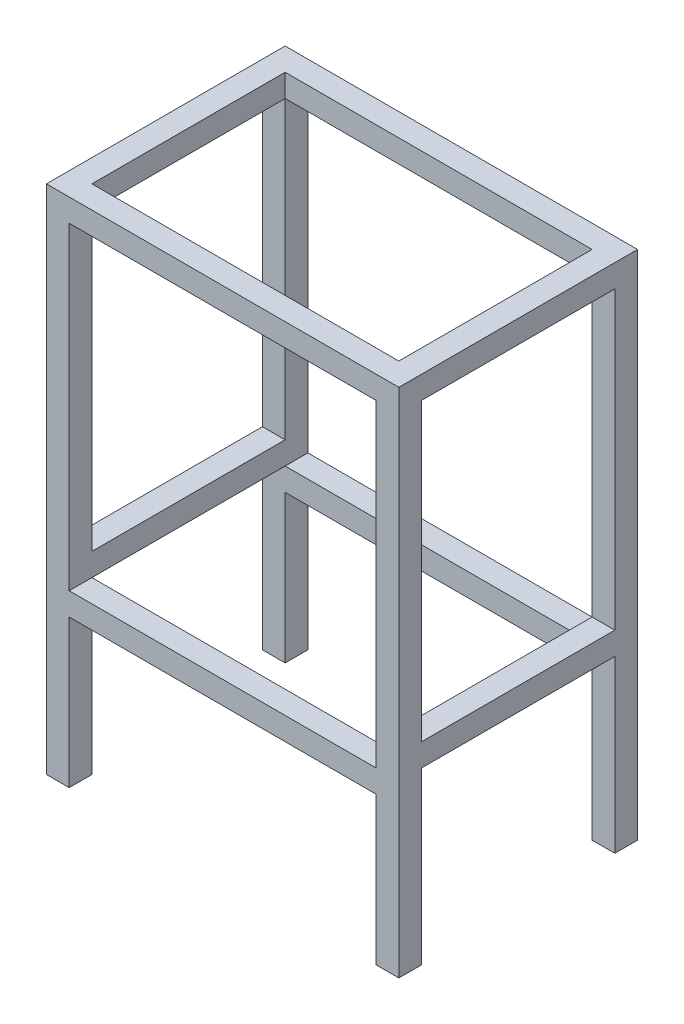
ISO-10303-21;
HEADER;
FILE_DESCRIPTION(('STEP AP214'),'2;1');
FILE_NAME('part.step','',(''),(''),'','','');
FILE_SCHEMA(('AUTOMOTIVE_DESIGN { 1 0 10303 214 1 1 1 1 }'));
ENDSEC;
DATA;
#1=APPLICATION_CONTEXT('core data for automotive mechanical design processes');
#2=APPLICATION_PROTOCOL_DEFINITION('international standard','automotive_design',2000,#1);
#3=PRODUCT_CONTEXT('',#1,'mechanical');
#4=PRODUCT('Part','Part','',(#3));
#5=PRODUCT_RELATED_PRODUCT_CATEGORY('part','',(#4));
#6=PRODUCT_DEFINITION_FORMATION('','',#4);
#7=PRODUCT_DEFINITION_CONTEXT('part definition',#1,'design');
#8=PRODUCT_DEFINITION('design','',#6,#7);
#9=PRODUCT_DEFINITION_SHAPE('','',#8);
#10=(LENGTH_UNIT() NAMED_UNIT(*) SI_UNIT(.MILLI.,.METRE.));
#11=(NAMED_UNIT(*) PLANE_ANGLE_UNIT() SI_UNIT($,.RADIAN.));
#12=(NAMED_UNIT(*) SI_UNIT($,.STERADIAN.) SOLID_ANGLE_UNIT());
#13=UNCERTAINTY_MEASURE_WITH_UNIT(LENGTH_MEASURE(1.E-05),#10,'distance_accuracy_value','');
#14=(GEOMETRIC_REPRESENTATION_CONTEXT(3) GLOBAL_UNCERTAINTY_ASSIGNED_CONTEXT((#13)) GLOBAL_UNIT_ASSIGNED_CONTEXT((#10,
#11,#12)) REPRESENTATION_CONTEXT('',''));
#15=CARTESIAN_POINT('',(0.,0.,0.));
#16=DIRECTION('',(0.,0.,1.));
#17=DIRECTION('',(1.,0.,0.));
#18=AXIS2_PLACEMENT_3D('',#15,#16,#17);
#19=CARTESIAN_POINT('',(-135.,450.,-85.));
#20=DIRECTION('',(0.,0.,-1.));
#21=DIRECTION('',(-1.,0.,0.));
#22=AXIS2_PLACEMENT_3D('',#19,#20,#21);
#23=PLANE('',#22);
#24=DIRECTION('',(1.,0.,0.));
#25=VECTOR('',#24,1.);
#26=CARTESIAN_POINT('',(-155.,150.,-85.0000000000001));
#27=LINE('',#26,#25);
#28=CARTESIAN_POINT('',(135.,150.,-85.));
#29=VERTEX_POINT('',#28);
#30=CARTESIAN_POINT('',(155.,150.,-85.));
#31=VERTEX_POINT('',#30);
#32=EDGE_CURVE('E423',#29,#31,#27,.T.);
#33=ORIENTED_EDGE('',*,*,#32,.F.);
#34=DIRECTION('',(-1.,0.,0.));
#35=VECTOR('',#34,1.);
#36=CARTESIAN_POINT('',(-135.,150.,-85.));
#37=LINE('',#36,#35);
#38=CARTESIAN_POINT('',(-135.,150.,-85.0000000000001));
#39=VERTEX_POINT('',#38);
#40=EDGE_CURVE('E286',#29,#39,#37,.T.);
#41=ORIENTED_EDGE('',*,*,#40,.T.);
#42=CARTESIAN_POINT('',(-155.,150.,-85.0000000000001));
#43=VERTEX_POINT('',#42);
#44=EDGE_CURVE('E440',#43,#39,#27,.T.);
#45=ORIENTED_EDGE('',*,*,#44,.F.);
#46=DIRECTION('',(0.,1.,0.));
#47=VECTOR('',#46,1.);
#48=CARTESIAN_POINT('',(-155.,0.,-85.));
#49=LINE('',#48,#47);
#50=CARTESIAN_POINT('',(-155.,0.,-85.));
#51=VERTEX_POINT('',#50);
#52=EDGE_CURVE('E410',#51,#43,#49,.T.);
#53=ORIENTED_EDGE('',*,*,#52,.F.);
#54=DIRECTION('',(1.,0.,0.));
#55=VECTOR('',#54,1.);
#56=CARTESIAN_POINT('',(-135.,0.,-85.));
#57=LINE('',#56,#55);
#58=CARTESIAN_POINT('',(-135.,0.,-85.));
#59=VERTEX_POINT('',#58);
#60=EDGE_CURVE('E525',#51,#59,#57,.T.);
#61=ORIENTED_EDGE('',*,*,#60,.T.);
#62=DIRECTION('',(0.,1.,0.));
#63=VECTOR('',#62,1.);
#64=CARTESIAN_POINT('',(-135.,450.,-85.));
#65=LINE('',#64,#63);
#66=CARTESIAN_POINT('',(-135.,130.,-85.));
#67=VERTEX_POINT('',#66);
#68=EDGE_CURVE('E405',#59,#67,#65,.T.);
#69=ORIENTED_EDGE('',*,*,#68,.T.);
#70=DIRECTION('',(1.,0.,0.));
#71=VECTOR('',#70,1.);
#72=CARTESIAN_POINT('',(-135.,130.,-85.));
#73=LINE('',#72,#71);
#74=CARTESIAN_POINT('',(135.,130.,-85.));
#75=VERTEX_POINT('',#74);
#76=EDGE_CURVE('E401',#67,#75,#73,.T.);
#77=ORIENTED_EDGE('',*,*,#76,.T.);
#78=DIRECTION('',(0.,-1.,0.));
#79=VECTOR('',#78,1.);
#80=CARTESIAN_POINT('',(135.,450.,-85.));
#81=LINE('',#80,#79);
#82=CARTESIAN_POINT('',(135.,0.,-85.));
#83=VERTEX_POINT('',#82);
#84=EDGE_CURVE('E383',#75,#83,#81,.T.);
#85=ORIENTED_EDGE('',*,*,#84,.T.);
#86=CARTESIAN_POINT('',(155.,0.,-85.));
#87=VERTEX_POINT('',#86);
#88=EDGE_CURVE('E507',#83,#87,#57,.T.);
#89=ORIENTED_EDGE('',*,*,#88,.T.);
#90=DIRECTION('',(0.,1.,0.));
#91=VECTOR('',#90,1.);
#92=CARTESIAN_POINT('',(155.,0.,-85.));
#93=LINE('',#92,#91);
#94=EDGE_CURVE('E409',#87,#31,#93,.T.);
#95=ORIENTED_EDGE('',*,*,#94,.T.);
#96=EDGE_LOOP('',(#33,#41,#45,#53,#61,#69,#77,#85,#89,#95));
#97=FACE_BOUND('',#96,.T.);
#98=ADVANCED_FACE('F69',(#97),#23,.F.);
#99=DIRECTION('',(1.,0.,0.));
#100=VECTOR('',#99,1.);
#101=CARTESIAN_POINT('',(-155.,170.,-85.0000000000001));
#102=LINE('',#101,#100);
#103=CARTESIAN_POINT('',(-155.,170.,-85.0000000000001));
#104=VERTEX_POINT('',#103);
#105=CARTESIAN_POINT('',(-135.,170.,-85.0000000000001));
#106=VERTEX_POINT('',#105);
#107=EDGE_CURVE('E485',#104,#106,#102,.T.);
#108=ORIENTED_EDGE('',*,*,#107,.T.);
#109=DIRECTION('',(0.,1.,0.));
#110=VECTOR('',#109,1.);
#111=CARTESIAN_POINT('',(-135.,450.,-85.));
#112=LINE('',#111,#110);
#113=CARTESIAN_POINT('',(-135.,430.,-85.0000000000001));
#114=VERTEX_POINT('',#113);
#115=EDGE_CURVE('E333',#106,#114,#112,.T.);
#116=ORIENTED_EDGE('',*,*,#115,.T.);
#117=DIRECTION('',(1.,0.,0.));
#118=VECTOR('',#117,1.);
#119=CARTESIAN_POINT('',(-155.,430.,-85.0000000000001));
#120=LINE('',#119,#118);
#121=CARTESIAN_POINT('',(-155.,430.,-85.0000000000001));
#122=VERTEX_POINT('',#121);
#123=EDGE_CURVE('E490',#122,#114,#120,.T.);
#124=ORIENTED_EDGE('',*,*,#123,.F.);
#125=DIRECTION('',(0.,-1.,0.));
#126=VECTOR('',#125,1.);
#127=CARTESIAN_POINT('',(-155.,430.,-85.0000000000001));
#128=LINE('',#127,#126);
#129=EDGE_CURVE('E458',#122,#104,#128,.T.);
#130=ORIENTED_EDGE('',*,*,#129,.T.);
#131=EDGE_LOOP('',(#108,#116,#124,#130));
#132=FACE_BOUND('',#131,.T.);
#133=ADVANCED_FACE('F657',(#132),#23,.F.);
#134=DIRECTION('',(0.,-1.,0.));
#135=VECTOR('',#134,1.);
#136=CARTESIAN_POINT('',(-135.,450.,-85.));
#137=LINE('',#136,#135);
#138=CARTESIAN_POINT('',(-135.,450.,-85.));
#139=VERTEX_POINT('',#138);
#140=EDGE_CURVE('E533',#139,#114,#137,.T.);
#141=ORIENTED_EDGE('',*,*,#140,.T.);
#142=DIRECTION('',(1.,0.,0.));
#143=VECTOR('',#142,1.);
#144=CARTESIAN_POINT('',(-135.,430.,-85.));
#145=LINE('',#144,#143);
#146=CARTESIAN_POINT('',(135.,430.,-85.));
#147=VERTEX_POINT('',#146);
#148=EDGE_CURVE('E341',#114,#147,#145,.T.);
#149=ORIENTED_EDGE('',*,*,#148,.T.);
#150=DIRECTION('',(0.,-1.,0.));
#151=VECTOR('',#150,1.);
#152=CARTESIAN_POINT('',(135.,450.,-85.));
#153=LINE('',#152,#151);
#154=CARTESIAN_POINT('',(135.,450.,-85.));
#155=VERTEX_POINT('',#154);
#156=EDGE_CURVE('E524',#155,#147,#153,.T.);
#157=ORIENTED_EDGE('',*,*,#156,.F.);
#158=DIRECTION('',(1.,0.,0.));
#159=VECTOR('',#158,1.);
#160=CARTESIAN_POINT('',(-135.,450.,-85.));
#161=LINE('',#160,#159);
#162=EDGE_CURVE('E508',#139,#155,#161,.T.);
#163=ORIENTED_EDGE('',*,*,#162,.F.);
#164=EDGE_LOOP('',(#141,#149,#157,#163));
#165=FACE_BOUND('',#164,.T.);
#166=ADVANCED_FACE('F649',(#165),#23,.F.);
#167=CARTESIAN_POINT('',(-135.,450.,85.));
#168=DIRECTION('',(0.,0.,-1.));
#169=DIRECTION('',(-1.,0.,0.));
#170=AXIS2_PLACEMENT_3D('',#167,#168,#169);
#171=PLANE('',#170);
#172=DIRECTION('',(-1.,0.,0.));
#173=VECTOR('',#172,1.);
#174=CARTESIAN_POINT('',(-135.,150.,85.));
#175=LINE('',#174,#173);
#176=CARTESIAN_POINT('',(135.,150.,85.));
#177=VERTEX_POINT('',#176);
#178=CARTESIAN_POINT('',(-135.,150.,85.));
#179=VERTEX_POINT('',#178);
#180=EDGE_CURVE('E12',#177,#179,#175,.T.);
#181=ORIENTED_EDGE('',*,*,#180,.F.);
#182=DIRECTION('',(1.,0.,0.));
#183=VECTOR('',#182,1.);
#184=CARTESIAN_POINT('',(-155.,150.,85.));
#185=LINE('',#184,#183);
#186=CARTESIAN_POINT('',(155.,150.,85.));
#187=VERTEX_POINT('',#186);
#188=EDGE_CURVE('E439',#177,#187,#185,.T.);
#189=ORIENTED_EDGE('',*,*,#188,.T.);
#190=DIRECTION('',(0.,-1.,0.));
#191=VECTOR('',#190,1.);
#192=CARTESIAN_POINT('',(155.,150.,85.));
#193=LINE('',#192,#191);
#194=CARTESIAN_POINT('',(155.,0.,85.));
#195=VERTEX_POINT('',#194);
#196=EDGE_CURVE('E415',#187,#195,#193,.T.);
#197=ORIENTED_EDGE('',*,*,#196,.T.);
#198=DIRECTION('',(1.,0.,0.));
#199=VECTOR('',#198,1.);
#200=CARTESIAN_POINT('',(-135.,0.,85.));
#201=LINE('',#200,#199);
#202=CARTESIAN_POINT('',(135.,0.,85.));
#203=VERTEX_POINT('',#202);
#204=EDGE_CURVE('E529',#203,#195,#201,.T.);
#205=ORIENTED_EDGE('',*,*,#204,.F.);
#206=DIRECTION('',(0.,-1.,0.));
#207=VECTOR('',#206,1.);
#208=CARTESIAN_POINT('',(135.,450.,85.));
#209=LINE('',#208,#207);
#210=CARTESIAN_POINT('',(135.,130.,85.));
#211=VERTEX_POINT('',#210);
#212=EDGE_CURVE('E605',#211,#203,#209,.T.);
#213=ORIENTED_EDGE('',*,*,#212,.F.);
#214=DIRECTION('',(1.,0.,0.));
#215=VECTOR('',#214,1.);
#216=CARTESIAN_POINT('',(-135.,130.,85.));
#217=LINE('',#216,#215);
#218=CARTESIAN_POINT('',(-135.,130.,85.));
#219=VERTEX_POINT('',#218);
#220=EDGE_CURVE('E608',#219,#211,#217,.T.);
#221=ORIENTED_EDGE('',*,*,#220,.F.);
#222=DIRECTION('',(0.,1.,0.));
#223=VECTOR('',#222,1.);
#224=CARTESIAN_POINT('',(-135.,450.,85.));
#225=LINE('',#224,#223);
#226=CARTESIAN_POINT('',(-135.,0.,85.));
#227=VERTEX_POINT('',#226);
#228=EDGE_CURVE('E612',#227,#219,#225,.T.);
#229=ORIENTED_EDGE('',*,*,#228,.F.);
#230=CARTESIAN_POINT('',(-155.,0.,85.));
#231=VERTEX_POINT('',#230);
#232=EDGE_CURVE('E513',#231,#227,#201,.T.);
#233=ORIENTED_EDGE('',*,*,#232,.F.);
#234=DIRECTION('',(0.,-1.,0.));
#235=VECTOR('',#234,1.);
#236=CARTESIAN_POINT('',(-155.,150.,85.));
#237=LINE('',#236,#235);
#238=CARTESIAN_POINT('',(-155.,150.,85.));
#239=VERTEX_POINT('',#238);
#240=EDGE_CURVE('E419',#239,#231,#237,.T.);
#241=ORIENTED_EDGE('',*,*,#240,.F.);
#242=EDGE_CURVE('E434',#239,#179,#185,.T.);
#243=ORIENTED_EDGE('',*,*,#242,.T.);
#244=EDGE_LOOP('',(#181,#189,#197,#205,#213,#221,#229,#233,#241,#243));
#245=FACE_BOUND('',#244,.T.);
#246=ADVANCED_FACE('F696',(#245),#171,.T.);
#247=DIRECTION('',(0.,1.,0.));
#248=VECTOR('',#247,1.);
#249=CARTESIAN_POINT('',(-135.,450.,85.));
#250=LINE('',#249,#248);
#251=CARTESIAN_POINT('',(-135.,170.,85.));
#252=VERTEX_POINT('',#251);
#253=CARTESIAN_POINT('',(-135.,430.,85.));
#254=VERTEX_POINT('',#253);
#255=EDGE_CURVE('E330',#252,#254,#250,.T.);
#256=ORIENTED_EDGE('',*,*,#255,.F.);
#257=DIRECTION('',(1.,0.,0.));
#258=VECTOR('',#257,1.);
#259=CARTESIAN_POINT('',(-155.,170.,85.));
#260=LINE('',#259,#258);
#261=CARTESIAN_POINT('',(-155.,170.,85.));
#262=VERTEX_POINT('',#261);
#263=EDGE_CURVE('E480',#262,#252,#260,.T.);
#264=ORIENTED_EDGE('',*,*,#263,.F.);
#265=DIRECTION('',(0.,1.,0.));
#266=VECTOR('',#265,1.);
#267=CARTESIAN_POINT('',(-155.,170.,85.));
#268=LINE('',#267,#266);
#269=CARTESIAN_POINT('',(-155.,430.,84.9999999999999));
#270=VERTEX_POINT('',#269);
#271=EDGE_CURVE('E451',#262,#270,#268,.T.);
#272=ORIENTED_EDGE('',*,*,#271,.T.);
#273=DIRECTION('',(1.,0.,0.));
#274=VECTOR('',#273,1.);
#275=CARTESIAN_POINT('',(-155.,430.,84.9999999999999));
#276=LINE('',#275,#274);
#277=EDGE_CURVE('E495',#270,#254,#276,.T.);
#278=ORIENTED_EDGE('',*,*,#277,.T.);
#279=EDGE_LOOP('',(#256,#264,#272,#278));
#280=FACE_BOUND('',#279,.T.);
#281=ADVANCED_FACE('F706',(#280),#171,.T.);
#282=DIRECTION('',(1.,0.,0.));
#283=VECTOR('',#282,1.);
#284=CARTESIAN_POINT('',(-135.,430.,85.));
#285=LINE('',#284,#283);
#286=CARTESIAN_POINT('',(135.,430.,85.));
#287=VERTEX_POINT('',#286);
#288=EDGE_CURVE('E78',#254,#287,#285,.T.);
#289=ORIENTED_EDGE('',*,*,#288,.F.);
#290=DIRECTION('',(0.,-1.,0.));
#291=VECTOR('',#290,1.);
#292=CARTESIAN_POINT('',(-135.,450.,85.));
#293=LINE('',#292,#291);
#294=CARTESIAN_POINT('',(-135.,450.,85.));
#295=VERTEX_POINT('',#294);
#296=EDGE_CURVE('E538',#295,#254,#293,.T.);
#297=ORIENTED_EDGE('',*,*,#296,.F.);
#298=DIRECTION('',(1.,0.,0.));
#299=VECTOR('',#298,1.);
#300=CARTESIAN_POINT('',(-135.,450.,85.));
#301=LINE('',#300,#299);
#302=CARTESIAN_POINT('',(135.,450.,85.));
#303=VERTEX_POINT('',#302);
#304=EDGE_CURVE('E517',#295,#303,#301,.T.);
#305=ORIENTED_EDGE('',*,*,#304,.T.);
#306=DIRECTION('',(0.,-1.,0.));
#307=VECTOR('',#306,1.);
#308=CARTESIAN_POINT('',(135.,450.,85.));
#309=LINE('',#308,#307);
#310=EDGE_CURVE('E542',#303,#287,#309,.T.);
#311=ORIENTED_EDGE('',*,*,#310,.T.);
#312=EDGE_LOOP('',(#289,#297,#305,#311));
#313=FACE_BOUND('',#312,.T.);
#314=ADVANCED_FACE('F641',(#313),#171,.T.);
#315=CARTESIAN_POINT('',(0.,0.,0.));
#316=DIRECTION('',(0.,-1.,0.));
#317=DIRECTION('',(0.,0.,-1.));
#318=AXIS2_PLACEMENT_3D('',#315,#316,#317);
#319=PLANE('',#318);
#320=DIRECTION('',(0.,0.,1.));
#321=VECTOR('',#320,1.);
#322=CARTESIAN_POINT('',(-135.,0.,-105.));
#323=LINE('',#322,#321);
#324=CARTESIAN_POINT('',(-135.,0.,-105.));
#325=VERTEX_POINT('',#324);
#326=EDGE_CURVE('E379',#325,#59,#323,.T.);
#327=ORIENTED_EDGE('',*,*,#326,.T.);
#328=ORIENTED_EDGE('',*,*,#60,.F.);
#329=DIRECTION('',(0.,0.,1.));
#330=VECTOR('',#329,1.);
#331=CARTESIAN_POINT('',(-155.,0.,-105.));
#332=LINE('',#331,#330);
#333=CARTESIAN_POINT('',(-155.,0.,-105.));
#334=VERTEX_POINT('',#333);
#335=EDGE_CURVE('E554',#334,#51,#332,.T.);
#336=ORIENTED_EDGE('',*,*,#335,.F.);
#337=DIRECTION('',(1.,0.,0.));
#338=VECTOR('',#337,1.);
#339=CARTESIAN_POINT('',(-155.,0.,-105.));
#340=LINE('',#339,#338);
#341=EDGE_CURVE('E565',#334,#325,#340,.T.);
#342=ORIENTED_EDGE('',*,*,#341,.T.);
#343=EDGE_LOOP('',(#327,#328,#336,#342));
#344=FACE_BOUND('',#343,.T.);
#345=ADVANCED_FACE('F700',(#344),#319,.T.);
#346=CARTESIAN_POINT('',(-135.,0.,105.));
#347=VERTEX_POINT('',#346);
#348=EDGE_CURVE('E384',#227,#347,#323,.T.);
#349=ORIENTED_EDGE('',*,*,#348,.T.);
#350=DIRECTION('',(1.,0.,0.));
#351=VECTOR('',#350,1.);
#352=CARTESIAN_POINT('',(-155.,0.,105.));
#353=LINE('',#352,#351);
#354=CARTESIAN_POINT('',(-155.,0.,105.));
#355=VERTEX_POINT('',#354);
#356=EDGE_CURVE('E575',#355,#347,#353,.T.);
#357=ORIENTED_EDGE('',*,*,#356,.F.);
#358=EDGE_CURVE('E579',#231,#355,#332,.T.);
#359=ORIENTED_EDGE('',*,*,#358,.F.);
#360=ORIENTED_EDGE('',*,*,#232,.T.);
#361=EDGE_LOOP('',(#349,#357,#359,#360));
#362=FACE_BOUND('',#361,.T.);
#363=ADVANCED_FACE('F735',(#362),#319,.T.);
#364=DIRECTION('',(0.,0.,1.));
#365=VECTOR('',#364,1.);
#366=CARTESIAN_POINT('',(135.,0.,-105.));
#367=LINE('',#366,#365);
#368=CARTESIAN_POINT('',(135.,0.,-105.));
#369=VERTEX_POINT('',#368);
#370=EDGE_CURVE('E395',#369,#83,#367,.T.);
#371=ORIENTED_EDGE('',*,*,#370,.F.);
#372=CARTESIAN_POINT('',(155.,0.,-105.));
#373=VERTEX_POINT('',#372);
#374=EDGE_CURVE('E537',#369,#373,#340,.T.);
#375=ORIENTED_EDGE('',*,*,#374,.T.);
#376=DIRECTION('',(0.,0.,1.));
#377=VECTOR('',#376,1.);
#378=CARTESIAN_POINT('',(155.,0.,-105.));
#379=LINE('',#378,#377);
#380=EDGE_CURVE('E570',#373,#87,#379,.T.);
#381=ORIENTED_EDGE('',*,*,#380,.T.);
#382=ORIENTED_EDGE('',*,*,#88,.F.);
#383=EDGE_LOOP('',(#371,#375,#381,#382));
#384=FACE_BOUND('',#383,.T.);
#385=ADVANCED_FACE('F701',(#384),#319,.T.);
#386=CARTESIAN_POINT('',(-155.,450.,-105.));
#387=DIRECTION('',(1.,0.,0.));
#388=DIRECTION('',(0.,0.,-1.));
#389=AXIS2_PLACEMENT_3D('',#386,#387,#388);
#390=PLANE('',#389);
#391=ORIENTED_EDGE('',*,*,#335,.T.);
#392=ORIENTED_EDGE('',*,*,#52,.T.);
#393=DIRECTION('',(0.,0.,1.));
#394=VECTOR('',#393,1.);
#395=CARTESIAN_POINT('',(-155.,150.,-85.0000000000001));
#396=LINE('',#395,#394);
#397=EDGE_CURVE('E414',#43,#239,#396,.T.);
#398=ORIENTED_EDGE('',*,*,#397,.T.);
#399=ORIENTED_EDGE('',*,*,#240,.T.);
#400=ORIENTED_EDGE('',*,*,#358,.T.);
#401=DIRECTION('',(0.,-1.,0.));
#402=VECTOR('',#401,1.);
#403=CARTESIAN_POINT('',(-155.,450.,105.));
#404=LINE('',#403,#402);
#405=CARTESIAN_POINT('',(-155.,450.,105.));
#406=VERTEX_POINT('',#405);
#407=EDGE_CURVE('E587',#406,#355,#404,.T.);
#408=ORIENTED_EDGE('',*,*,#407,.F.);
#409=DIRECTION('',(0.,0.,1.));
#410=VECTOR('',#409,1.);
#411=CARTESIAN_POINT('',(-155.,450.,-105.));
#412=LINE('',#411,#410);
#413=CARTESIAN_POINT('',(-155.,450.,-105.));
#414=VERTEX_POINT('',#413);
#415=EDGE_CURVE('E561',#414,#406,#412,.T.);
#416=ORIENTED_EDGE('',*,*,#415,.F.);
#417=DIRECTION('',(0.,-1.,0.));
#418=VECTOR('',#417,1.);
#419=CARTESIAN_POINT('',(-155.,450.,-105.));
#420=LINE('',#419,#418);
#421=EDGE_CURVE('E583',#414,#334,#420,.T.);
#422=ORIENTED_EDGE('',*,*,#421,.T.);
#423=EDGE_LOOP('',(#391,#392,#398,#399,#400,#408,#416,#422));
#424=FACE_BOUND('',#423,.T.);
#425=ORIENTED_EDGE('',*,*,#271,.F.);
#426=DIRECTION('',(0.,0.,1.));
#427=VECTOR('',#426,1.);
#428=CARTESIAN_POINT('',(-155.,170.,-85.0000000000001));
#429=LINE('',#428,#427);
#430=EDGE_CURVE('E462',#104,#262,#429,.T.);
#431=ORIENTED_EDGE('',*,*,#430,.F.);
#432=ORIENTED_EDGE('',*,*,#129,.F.);
#433=DIRECTION('',(0.,0.,-1.));
#434=VECTOR('',#433,1.);
#435=CARTESIAN_POINT('',(-155.,430.,84.9999999999999));
#436=LINE('',#435,#434);
#437=EDGE_CURVE('E454',#270,#122,#436,.T.);
#438=ORIENTED_EDGE('',*,*,#437,.F.);
#439=EDGE_LOOP('',(#425,#431,#432,#438));
#440=FACE_BOUND('',#439,.T.);
#441=ADVANCED_FACE('F673',(#424,#440),#390,.F.);
#442=CARTESIAN_POINT('',(155.,450.,-105.));
#443=DIRECTION('',(1.,0.,0.));
#444=DIRECTION('',(0.,0.,-1.));
#445=AXIS2_PLACEMENT_3D('',#442,#443,#444);
#446=PLANE('',#445);
#447=ORIENTED_EDGE('',*,*,#94,.F.);
#448=ORIENTED_EDGE('',*,*,#380,.F.);
#449=DIRECTION('',(0.,-1.,0.));
#450=VECTOR('',#449,1.);
#451=CARTESIAN_POINT('',(155.,450.,-105.));
#452=LINE('',#451,#450);
#453=CARTESIAN_POINT('',(155.,450.,-105.));
#454=VERTEX_POINT('',#453);
#455=EDGE_CURVE('E564',#454,#373,#452,.T.);
#456=ORIENTED_EDGE('',*,*,#455,.F.);
#457=DIRECTION('',(0.,0.,1.));
#458=VECTOR('',#457,1.);
#459=CARTESIAN_POINT('',(155.,450.,-105.));
#460=LINE('',#459,#458);
#461=CARTESIAN_POINT('',(155.,450.,105.));
#462=VERTEX_POINT('',#461);
#463=EDGE_CURVE('E553',#454,#462,#460,.T.);
#464=ORIENTED_EDGE('',*,*,#463,.T.);
#465=DIRECTION('',(0.,-1.,0.));
#466=VECTOR('',#465,1.);
#467=CARTESIAN_POINT('',(155.,450.,105.));
#468=LINE('',#467,#466);
#469=CARTESIAN_POINT('',(155.,0.,105.));
#470=VERTEX_POINT('',#469);
#471=EDGE_CURVE('E591',#462,#470,#468,.T.);
#472=ORIENTED_EDGE('',*,*,#471,.T.);
#473=EDGE_CURVE('E569',#195,#470,#379,.T.);
#474=ORIENTED_EDGE('',*,*,#473,.F.);
#475=ORIENTED_EDGE('',*,*,#196,.F.);
#476=DIRECTION('',(0.,0.,1.));
#477=VECTOR('',#476,1.);
#478=CARTESIAN_POINT('',(155.,150.,-85.));
#479=LINE('',#478,#477);
#480=EDGE_CURVE('E427',#31,#187,#479,.T.);
#481=ORIENTED_EDGE('',*,*,#480,.F.);
#482=EDGE_LOOP('',(#447,#448,#456,#464,#472,#474,#475,#481));
#483=FACE_BOUND('',#482,.T.);
#484=DIRECTION('',(0.,0.,1.));
#485=VECTOR('',#484,1.);
#486=CARTESIAN_POINT('',(155.,170.,-85.));
#487=LINE('',#486,#485);
#488=CARTESIAN_POINT('',(155.,170.,-85.));
#489=VERTEX_POINT('',#488);
#490=CARTESIAN_POINT('',(155.,170.,85.));
#491=VERTEX_POINT('',#490);
#492=EDGE_CURVE('E455',#489,#491,#487,.T.);
#493=ORIENTED_EDGE('',*,*,#492,.T.);
#494=DIRECTION('',(0.,1.,0.));
#495=VECTOR('',#494,1.);
#496=CARTESIAN_POINT('',(155.,170.,85.));
#497=LINE('',#496,#495);
#498=CARTESIAN_POINT('',(155.,430.,85.));
#499=VERTEX_POINT('',#498);
#500=EDGE_CURVE('E450',#491,#499,#497,.T.);
#501=ORIENTED_EDGE('',*,*,#500,.T.);
#502=DIRECTION('',(0.,0.,-1.));
#503=VECTOR('',#502,1.);
#504=CARTESIAN_POINT('',(155.,430.,85.));
#505=LINE('',#504,#503);
#506=CARTESIAN_POINT('',(155.,430.,-85.));
#507=VERTEX_POINT('',#506);
#508=EDGE_CURVE('E469',#499,#507,#505,.T.);
#509=ORIENTED_EDGE('',*,*,#508,.T.);
#510=DIRECTION('',(0.,-1.,0.));
#511=VECTOR('',#510,1.);
#512=CARTESIAN_POINT('',(155.,430.,-85.));
#513=LINE('',#512,#511);
#514=EDGE_CURVE('E473',#507,#489,#513,.T.);
#515=ORIENTED_EDGE('',*,*,#514,.T.);
#516=EDGE_LOOP('',(#493,#501,#509,#515));
#517=FACE_BOUND('',#516,.T.);
#518=ADVANCED_FACE('F666',(#483,#517),#446,.T.);
#519=CARTESIAN_POINT('',(-135.,450.,-85.));
#520=DIRECTION('',(1.,0.,0.));
#521=DIRECTION('',(0.,0.,-1.));
#522=AXIS2_PLACEMENT_3D('',#519,#520,#521);
#523=PLANE('',#522);
#524=ORIENTED_EDGE('',*,*,#296,.T.);
#525=DIRECTION('',(0.,0.,-1.));
#526=VECTOR('',#525,1.);
#527=CARTESIAN_POINT('',(-135.,430.,-85.));
#528=LINE('',#527,#526);
#529=EDGE_CURVE('E503',#254,#114,#528,.T.);
#530=ORIENTED_EDGE('',*,*,#529,.T.);
#531=ORIENTED_EDGE('',*,*,#140,.F.);
#532=DIRECTION('',(0.,0.,1.));
#533=VECTOR('',#532,1.);
#534=CARTESIAN_POINT('',(-135.,450.,-85.));
#535=LINE('',#534,#533);
#536=EDGE_CURVE('E521',#139,#295,#535,.T.);
#537=ORIENTED_EDGE('',*,*,#536,.T.);
#538=EDGE_LOOP('',(#524,#530,#531,#537));
#539=FACE_BOUND('',#538,.T.);
#540=ADVANCED_FACE('F664',(#539),#523,.T.);
#541=DIRECTION('',(0.,0.,1.));
#542=VECTOR('',#541,1.);
#543=CARTESIAN_POINT('',(-135.,150.,-85.0000000000001));
#544=LINE('',#543,#542);
#545=EDGE_CURVE('E446',#39,#179,#544,.T.);
#546=ORIENTED_EDGE('',*,*,#545,.F.);
#547=DIRECTION('',(0.,0.,1.));
#548=VECTOR('',#547,1.);
#549=CARTESIAN_POINT('',(-135.,150.,-105.));
#550=LINE('',#549,#548);
#551=CARTESIAN_POINT('',(-135.,150.,-105.));
#552=VERTEX_POINT('',#551);
#553=EDGE_CURVE('E309',#552,#39,#550,.T.);
#554=ORIENTED_EDGE('',*,*,#553,.F.);
#555=DIRECTION('',(0.,-1.,0.));
#556=VECTOR('',#555,1.);
#557=CARTESIAN_POINT('',(-135.,150.,-105.));
#558=LINE('',#557,#556);
#559=CARTESIAN_POINT('',(-135.,430.,-105.));
#560=VERTEX_POINT('',#559);
#561=EDGE_CURVE('E301',#560,#552,#558,.T.);
#562=ORIENTED_EDGE('',*,*,#561,.F.);
#563=DIRECTION('',(0.,0.,1.));
#564=VECTOR('',#563,1.);
#565=CARTESIAN_POINT('',(-135.,430.,-105.));
#566=LINE('',#565,#564);
#567=EDGE_CURVE('E314',#560,#114,#566,.T.);
#568=ORIENTED_EDGE('',*,*,#567,.T.);
#569=ORIENTED_EDGE('',*,*,#115,.F.);
#570=DIRECTION('',(0.,0.,1.));
#571=VECTOR('',#570,1.);
#572=CARTESIAN_POINT('',(-135.,170.,-85.));
#573=LINE('',#572,#571);
#574=EDGE_CURVE('E499',#106,#252,#573,.T.);
#575=ORIENTED_EDGE('',*,*,#574,.T.);
#576=ORIENTED_EDGE('',*,*,#255,.T.);
#577=CARTESIAN_POINT('',(-135.,430.,105.));
#578=VERTEX_POINT('',#577);
#579=EDGE_CURVE('E318',#254,#578,#566,.T.);
#580=ORIENTED_EDGE('',*,*,#579,.T.);
#581=DIRECTION('',(0.,1.,0.));
#582=VECTOR('',#581,1.);
#583=CARTESIAN_POINT('',(-135.,450.,105.));
#584=LINE('',#583,#582);
#585=CARTESIAN_POINT('',(-135.,150.,105.));
#586=VERTEX_POINT('',#585);
#587=EDGE_CURVE('E337',#586,#578,#584,.T.);
#588=ORIENTED_EDGE('',*,*,#587,.F.);
#589=EDGE_CURVE('E313',#179,#586,#550,.T.);
#590=ORIENTED_EDGE('',*,*,#589,.F.);
#591=EDGE_LOOP('',(#546,#554,#562,#568,#569,#575,#576,#580,#588,#590));
#592=FACE_BOUND('',#591,.T.);
#593=ADVANCED_FACE('F653',(#592),#523,.T.);
#594=CARTESIAN_POINT('',(135.,450.,-85.));
#595=DIRECTION('',(1.,0.,0.));
#596=DIRECTION('',(0.,0.,-1.));
#597=AXIS2_PLACEMENT_3D('',#594,#595,#596);
#598=PLANE('',#597);
#599=DIRECTION('',(0.,0.,-1.));
#600=VECTOR('',#599,1.);
#601=CARTESIAN_POINT('',(135.,430.,-85.));
#602=LINE('',#601,#600);
#603=EDGE_CURVE('E601',#287,#147,#602,.T.);
#604=ORIENTED_EDGE('',*,*,#603,.F.);
#605=ORIENTED_EDGE('',*,*,#310,.F.);
#606=DIRECTION('',(0.,0.,1.));
#607=VECTOR('',#606,1.);
#608=CARTESIAN_POINT('',(135.,450.,-85.));
#609=LINE('',#608,#607);
#610=EDGE_CURVE('E512',#155,#303,#609,.T.);
#611=ORIENTED_EDGE('',*,*,#610,.F.);
#612=ORIENTED_EDGE('',*,*,#156,.T.);
#613=EDGE_LOOP('',(#604,#605,#611,#612));
#614=FACE_BOUND('',#613,.T.);
#615=ADVANCED_FACE('F639',(#614),#598,.F.);
#616=DIRECTION('',(0.,0.,1.));
#617=VECTOR('',#616,1.);
#618=CARTESIAN_POINT('',(135.,170.,-85.));
#619=LINE('',#618,#617);
#620=CARTESIAN_POINT('',(135.,170.,-85.));
#621=VERTEX_POINT('',#620);
#622=CARTESIAN_POINT('',(135.,170.,85.));
#623=VERTEX_POINT('',#622);
#624=EDGE_CURVE('E586',#621,#623,#619,.T.);
#625=ORIENTED_EDGE('',*,*,#624,.F.);
#626=DIRECTION('',(0.,-1.,0.));
#627=VECTOR('',#626,1.);
#628=CARTESIAN_POINT('',(135.,450.,-85.));
#629=LINE('',#628,#627);
#630=EDGE_CURVE('E323',#147,#621,#629,.T.);
#631=ORIENTED_EDGE('',*,*,#630,.F.);
#632=DIRECTION('',(0.,0.,1.));
#633=VECTOR('',#632,1.);
#634=CARTESIAN_POINT('',(135.,430.,-105.));
#635=LINE('',#634,#633);
#636=CARTESIAN_POINT('',(135.,430.,-105.));
#637=VERTEX_POINT('',#636);
#638=EDGE_CURVE('E295',#637,#147,#635,.T.);
#639=ORIENTED_EDGE('',*,*,#638,.F.);
#640=DIRECTION('',(0.,1.,0.));
#641=VECTOR('',#640,1.);
#642=CARTESIAN_POINT('',(135.,430.,-105.));
#643=LINE('',#642,#641);
#644=CARTESIAN_POINT('',(135.,150.,-105.));
#645=VERTEX_POINT('',#644);
#646=EDGE_CURVE('E292',#645,#637,#643,.T.);
#647=ORIENTED_EDGE('',*,*,#646,.F.);
#648=DIRECTION('',(0.,0.,1.));
#649=VECTOR('',#648,1.);
#650=CARTESIAN_POINT('',(135.,150.,-105.));
#651=LINE('',#650,#649);
#652=EDGE_CURVE('E279',#645,#29,#651,.T.);
#653=ORIENTED_EDGE('',*,*,#652,.T.);
#654=DIRECTION('',(0.,0.,1.));
#655=VECTOR('',#654,1.);
#656=CARTESIAN_POINT('',(135.,150.,-85.0000000000001));
#657=LINE('',#656,#655);
#658=EDGE_CURVE('E438',#29,#177,#657,.T.);
#659=ORIENTED_EDGE('',*,*,#658,.T.);
#660=CARTESIAN_POINT('',(135.,150.,105.));
#661=VERTEX_POINT('',#660);
#662=EDGE_CURVE('E93',#177,#661,#651,.T.);
#663=ORIENTED_EDGE('',*,*,#662,.T.);
#664=DIRECTION('',(0.,-1.,0.));
#665=VECTOR('',#664,1.);
#666=CARTESIAN_POINT('',(135.,450.,105.));
#667=LINE('',#666,#665);
#668=CARTESIAN_POINT('',(135.,430.,105.));
#669=VERTEX_POINT('',#668);
#670=EDGE_CURVE('E326',#669,#661,#667,.T.);
#671=ORIENTED_EDGE('',*,*,#670,.F.);
#672=EDGE_CURVE('E289',#287,#669,#635,.T.);
#673=ORIENTED_EDGE('',*,*,#672,.F.);
#674=DIRECTION('',(0.,-1.,0.));
#675=VECTOR('',#674,1.);
#676=CARTESIAN_POINT('',(135.,450.,85.));
#677=LINE('',#676,#675);
#678=EDGE_CURVE('E312',#287,#623,#677,.T.);
#679=ORIENTED_EDGE('',*,*,#678,.T.);
#680=EDGE_LOOP('',(#625,#631,#639,#647,#653,#659,#663,#671,#673,#679));
#681=FACE_BOUND('',#680,.T.);
#682=ADVANCED_FACE('F294',(#681),#598,.F.);
#683=CARTESIAN_POINT('',(-155.,450.,-105.));
#684=DIRECTION('',(0.,0.,-1.));
#685=DIRECTION('',(-1.,0.,0.));
#686=AXIS2_PLACEMENT_3D('',#683,#684,#685);
#687=PLANE('',#686);
#688=DIRECTION('',(1.,0.,0.));
#689=VECTOR('',#688,1.);
#690=CARTESIAN_POINT('',(-135.,150.,-105.));
#691=LINE('',#690,#689);
#692=EDGE_CURVE('E283',#552,#645,#691,.T.);
#693=ORIENTED_EDGE('',*,*,#692,.T.);
#694=ORIENTED_EDGE('',*,*,#646,.T.);
#695=DIRECTION('',(-1.,0.,0.));
#696=VECTOR('',#695,1.);
#697=CARTESIAN_POINT('',(-135.,430.,-105.));
#698=LINE('',#697,#696);
#699=EDGE_CURVE('E85',#637,#560,#698,.T.);
#700=ORIENTED_EDGE('',*,*,#699,.T.);
#701=ORIENTED_EDGE('',*,*,#561,.T.);
#702=EDGE_LOOP('',(#693,#694,#700,#701));
#703=FACE_BOUND('',#702,.T.);
#704=DIRECTION('',(0.,-1.,0.));
#705=VECTOR('',#704,1.);
#706=CARTESIAN_POINT('',(-135.,0.,-105.));
#707=LINE('',#706,#705);
#708=CARTESIAN_POINT('',(-135.,130.,-105.));
#709=VERTEX_POINT('',#708);
#710=EDGE_CURVE('E365',#709,#325,#707,.T.);
#711=ORIENTED_EDGE('',*,*,#710,.T.);
#712=ORIENTED_EDGE('',*,*,#341,.F.);
#713=ORIENTED_EDGE('',*,*,#421,.F.);
#714=DIRECTION('',(1.,0.,0.));
#715=VECTOR('',#714,1.);
#716=CARTESIAN_POINT('',(-155.,450.,-105.));
#717=LINE('',#716,#715);
#718=EDGE_CURVE('E549',#414,#454,#717,.T.);
#719=ORIENTED_EDGE('',*,*,#718,.T.);
#720=ORIENTED_EDGE('',*,*,#455,.T.);
#721=ORIENTED_EDGE('',*,*,#374,.F.);
#722=DIRECTION('',(0.,1.,0.));
#723=VECTOR('',#722,1.);
#724=CARTESIAN_POINT('',(135.,130.,-105.));
#725=LINE('',#724,#723);
#726=CARTESIAN_POINT('',(135.,130.,-105.));
#727=VERTEX_POINT('',#726);
#728=EDGE_CURVE('E356',#369,#727,#725,.T.);
#729=ORIENTED_EDGE('',*,*,#728,.T.);
#730=DIRECTION('',(-1.,0.,0.));
#731=VECTOR('',#730,1.);
#732=CARTESIAN_POINT('',(-135.,130.,-105.));
#733=LINE('',#732,#731);
#734=EDGE_CURVE('E360',#727,#709,#733,.T.);
#735=ORIENTED_EDGE('',*,*,#734,.T.);
#736=EDGE_LOOP('',(#711,#712,#713,#719,#720,#721,#729,#735));
#737=FACE_BOUND('',#736,.T.);
#738=ADVANCED_FACE('F71',(#703,#737),#687,.T.);
#739=CARTESIAN_POINT('',(-155.,450.,105.));
#740=DIRECTION('',(0.,0.,-1.));
#741=DIRECTION('',(-1.,0.,0.));
#742=AXIS2_PLACEMENT_3D('',#739,#740,#741);
#743=PLANE('',#742);
#744=ORIENTED_EDGE('',*,*,#670,.T.);
#745=DIRECTION('',(-1.,0.,0.));
#746=VECTOR('',#745,1.);
#747=CARTESIAN_POINT('',(-155.,150.,105.));
#748=LINE('',#747,#746);
#749=EDGE_CURVE('E351',#661,#586,#748,.T.);
#750=ORIENTED_EDGE('',*,*,#749,.T.);
#751=ORIENTED_EDGE('',*,*,#587,.T.);
#752=DIRECTION('',(1.,0.,0.));
#753=VECTOR('',#752,1.);
#754=CARTESIAN_POINT('',(-155.,430.,105.));
#755=LINE('',#754,#753);
#756=EDGE_CURVE('E345',#578,#669,#755,.T.);
#757=ORIENTED_EDGE('',*,*,#756,.T.);
#758=EDGE_LOOP('',(#744,#750,#751,#757));
#759=FACE_BOUND('',#758,.T.);
#760=ORIENTED_EDGE('',*,*,#356,.T.);
#761=DIRECTION('',(0.,-1.,0.));
#762=VECTOR('',#761,1.);
#763=CARTESIAN_POINT('',(-135.,0.,105.));
#764=LINE('',#763,#762);
#765=CARTESIAN_POINT('',(-135.,130.,105.));
#766=VERTEX_POINT('',#765);
#767=EDGE_CURVE('E361',#766,#347,#764,.T.);
#768=ORIENTED_EDGE('',*,*,#767,.F.);
#769=DIRECTION('',(-1.,0.,0.));
#770=VECTOR('',#769,1.);
#771=CARTESIAN_POINT('',(-135.,130.,105.));
#772=LINE('',#771,#770);
#773=CARTESIAN_POINT('',(135.,130.,105.));
#774=VERTEX_POINT('',#773);
#775=EDGE_CURVE('E373',#774,#766,#772,.T.);
#776=ORIENTED_EDGE('',*,*,#775,.F.);
#777=DIRECTION('',(0.,1.,0.));
#778=VECTOR('',#777,1.);
#779=CARTESIAN_POINT('',(135.,130.,105.));
#780=LINE('',#779,#778);
#781=CARTESIAN_POINT('',(135.,0.,105.));
#782=VERTEX_POINT('',#781);
#783=EDGE_CURVE('E355',#782,#774,#780,.T.);
#784=ORIENTED_EDGE('',*,*,#783,.F.);
#785=EDGE_CURVE('E574',#782,#470,#353,.T.);
#786=ORIENTED_EDGE('',*,*,#785,.T.);
#787=ORIENTED_EDGE('',*,*,#471,.F.);
#788=DIRECTION('',(1.,0.,0.));
#789=VECTOR('',#788,1.);
#790=CARTESIAN_POINT('',(-155.,450.,105.));
#791=LINE('',#790,#789);
#792=EDGE_CURVE('E558',#406,#462,#791,.T.);
#793=ORIENTED_EDGE('',*,*,#792,.F.);
#794=ORIENTED_EDGE('',*,*,#407,.T.);
#795=EDGE_LOOP('',(#760,#768,#776,#784,#786,#787,#793,#794));
#796=FACE_BOUND('',#795,.T.);
#797=ADVANCED_FACE('F720',(#759,#796),#743,.F.);
#798=CARTESIAN_POINT('',(0.,450.,0.));
#799=DIRECTION('',(0.,-1.,0.));
#800=DIRECTION('',(0.,0.,-1.));
#801=AXIS2_PLACEMENT_3D('',#798,#799,#800);
#802=PLANE('',#801);
#803=ORIENTED_EDGE('',*,*,#536,.F.);
#804=ORIENTED_EDGE('',*,*,#162,.T.);
#805=ORIENTED_EDGE('',*,*,#610,.T.);
#806=ORIENTED_EDGE('',*,*,#304,.F.);
#807=EDGE_LOOP('',(#803,#804,#805,#806));
#808=FACE_BOUND('',#807,.T.);
#809=ORIENTED_EDGE('',*,*,#718,.F.);
#810=ORIENTED_EDGE('',*,*,#415,.T.);
#811=ORIENTED_EDGE('',*,*,#792,.T.);
#812=ORIENTED_EDGE('',*,*,#463,.F.);
#813=EDGE_LOOP('',(#809,#810,#811,#812));
#814=FACE_BOUND('',#813,.T.);
#815=ADVANCED_FACE('F645',(#808,#814),#802,.F.);
#816=EDGE_CURVE('E369',#203,#782,#367,.T.);
#817=ORIENTED_EDGE('',*,*,#816,.F.);
#818=ORIENTED_EDGE('',*,*,#204,.T.);
#819=ORIENTED_EDGE('',*,*,#473,.T.);
#820=ORIENTED_EDGE('',*,*,#785,.F.);
#821=EDGE_LOOP('',(#817,#818,#819,#820));
#822=FACE_BOUND('',#821,.T.);
#823=ADVANCED_FACE('F689',(#822),#319,.T.);
#824=EDGE_CURVE('E489',#147,#507,#120,.T.);
#825=ORIENTED_EDGE('',*,*,#824,.F.);
#826=ORIENTED_EDGE('',*,*,#630,.T.);
#827=EDGE_CURVE('E484',#621,#489,#102,.T.);
#828=ORIENTED_EDGE('',*,*,#827,.T.);
#829=ORIENTED_EDGE('',*,*,#514,.F.);
#830=EDGE_LOOP('',(#825,#826,#828,#829));
#831=FACE_BOUND('',#830,.T.);
#832=ADVANCED_FACE('F680',(#831),#23,.F.);
#833=ORIENTED_EDGE('',*,*,#678,.F.);
#834=EDGE_CURVE('E494',#287,#499,#276,.T.);
#835=ORIENTED_EDGE('',*,*,#834,.T.);
#836=ORIENTED_EDGE('',*,*,#500,.F.);
#837=EDGE_CURVE('E465',#623,#491,#260,.T.);
#838=ORIENTED_EDGE('',*,*,#837,.F.);
#839=EDGE_LOOP('',(#833,#835,#836,#838));
#840=FACE_BOUND('',#839,.T.);
#841=ADVANCED_FACE('F630',(#840),#171,.T.);
#842=CARTESIAN_POINT('',(-155.,170.,-85.0000000000001));
#843=DIRECTION('',(0.,1.,0.));
#844=DIRECTION('',(0.,0.,1.));
#845=AXIS2_PLACEMENT_3D('',#842,#843,#844);
#846=PLANE('',#845);
#847=ORIENTED_EDGE('',*,*,#624,.T.);
#848=ORIENTED_EDGE('',*,*,#837,.T.);
#849=ORIENTED_EDGE('',*,*,#492,.F.);
#850=ORIENTED_EDGE('',*,*,#827,.F.);
#851=EDGE_LOOP('',(#847,#848,#849,#850));
#852=FACE_BOUND('',#851,.T.);
#853=ADVANCED_FACE('F695',(#852),#846,.T.);
#854=CARTESIAN_POINT('',(-155.,430.,84.9999999999999));
#855=DIRECTION('',(0.,-1.,0.));
#856=DIRECTION('',(0.,0.,-1.));
#857=AXIS2_PLACEMENT_3D('',#854,#855,#856);
#858=PLANE('',#857);
#859=ORIENTED_EDGE('',*,*,#603,.T.);
#860=ORIENTED_EDGE('',*,*,#824,.T.);
#861=ORIENTED_EDGE('',*,*,#508,.F.);
#862=ORIENTED_EDGE('',*,*,#834,.F.);
#863=EDGE_LOOP('',(#859,#860,#861,#862));
#864=FACE_BOUND('',#863,.T.);
#865=ADVANCED_FACE('F635',(#864),#858,.T.);
#866=ORIENTED_EDGE('',*,*,#277,.F.);
#867=ORIENTED_EDGE('',*,*,#437,.T.);
#868=ORIENTED_EDGE('',*,*,#123,.T.);
#869=ORIENTED_EDGE('',*,*,#529,.F.);
#870=EDGE_LOOP('',(#866,#867,#868,#869));
#871=FACE_BOUND('',#870,.T.);
#872=ADVANCED_FACE('F661',(#871),#858,.T.);
#873=ORIENTED_EDGE('',*,*,#107,.F.);
#874=ORIENTED_EDGE('',*,*,#430,.T.);
#875=ORIENTED_EDGE('',*,*,#263,.T.);
#876=ORIENTED_EDGE('',*,*,#574,.F.);
#877=EDGE_LOOP('',(#873,#874,#875,#876));
#878=FACE_BOUND('',#877,.T.);
#879=ADVANCED_FACE('F743',(#878),#846,.T.);
#880=CARTESIAN_POINT('',(-155.,150.,-85.0000000000001));
#881=DIRECTION('',(0.,1.,0.));
#882=DIRECTION('',(0.,0.,1.));
#883=AXIS2_PLACEMENT_3D('',#880,#881,#882);
#884=PLANE('',#883);
#885=ORIENTED_EDGE('',*,*,#545,.T.);
#886=ORIENTED_EDGE('',*,*,#242,.F.);
#887=ORIENTED_EDGE('',*,*,#397,.F.);
#888=ORIENTED_EDGE('',*,*,#44,.T.);
#889=EDGE_LOOP('',(#885,#886,#887,#888));
#890=FACE_BOUND('',#889,.T.);
#891=ADVANCED_FACE('F804',(#890),#884,.F.);
#892=ORIENTED_EDGE('',*,*,#32,.T.);
#893=ORIENTED_EDGE('',*,*,#480,.T.);
#894=ORIENTED_EDGE('',*,*,#188,.F.);
#895=ORIENTED_EDGE('',*,*,#658,.F.);
#896=EDGE_LOOP('',(#892,#893,#894,#895));
#897=FACE_BOUND('',#896,.T.);
#898=ADVANCED_FACE('F807',(#897),#884,.F.);
#899=CARTESIAN_POINT('',(135.,130.,-105.));
#900=DIRECTION('',(1.,0.,0.));
#901=DIRECTION('',(0.,1.,0.));
#902=AXIS2_PLACEMENT_3D('',#899,#900,#901);
#903=PLANE('',#902);
#904=ORIENTED_EDGE('',*,*,#212,.T.);
#905=ORIENTED_EDGE('',*,*,#816,.T.);
#906=ORIENTED_EDGE('',*,*,#783,.T.);
#907=DIRECTION('',(0.,0.,1.));
#908=VECTOR('',#907,1.);
#909=CARTESIAN_POINT('',(135.,130.,-105.));
#910=LINE('',#909,#908);
#911=EDGE_CURVE('E394',#211,#774,#910,.T.);
#912=ORIENTED_EDGE('',*,*,#911,.F.);
#913=EDGE_LOOP('',(#904,#905,#906,#912));
#914=FACE_BOUND('',#913,.T.);
#915=ADVANCED_FACE('F830',(#914),#903,.F.);
#916=CARTESIAN_POINT('',(-135.,130.,-105.));
#917=DIRECTION('',(0.,1.,0.));
#918=DIRECTION('',(0.,0.,1.));
#919=AXIS2_PLACEMENT_3D('',#916,#917,#918);
#920=PLANE('',#919);
#921=ORIENTED_EDGE('',*,*,#220,.T.);
#922=ORIENTED_EDGE('',*,*,#911,.T.);
#923=ORIENTED_EDGE('',*,*,#775,.T.);
#924=DIRECTION('',(0.,0.,1.));
#925=VECTOR('',#924,1.);
#926=CARTESIAN_POINT('',(-135.,130.,-105.));
#927=LINE('',#926,#925);
#928=EDGE_CURVE('E389',#219,#766,#927,.T.);
#929=ORIENTED_EDGE('',*,*,#928,.F.);
#930=EDGE_LOOP('',(#921,#922,#923,#929));
#931=FACE_BOUND('',#930,.T.);
#932=ADVANCED_FACE('F785',(#931),#920,.F.);
#933=CARTESIAN_POINT('',(-135.,0.,-105.));
#934=DIRECTION('',(-1.,0.,0.));
#935=DIRECTION('',(0.,0.,1.));
#936=AXIS2_PLACEMENT_3D('',#933,#934,#935);
#937=PLANE('',#936);
#938=ORIENTED_EDGE('',*,*,#228,.T.);
#939=ORIENTED_EDGE('',*,*,#928,.T.);
#940=ORIENTED_EDGE('',*,*,#767,.T.);
#941=ORIENTED_EDGE('',*,*,#348,.F.);
#942=EDGE_LOOP('',(#938,#939,#940,#941));
#943=FACE_BOUND('',#942,.T.);
#944=ADVANCED_FACE('F779',(#943),#937,.F.);
#945=ORIENTED_EDGE('',*,*,#326,.F.);
#946=ORIENTED_EDGE('',*,*,#710,.F.);
#947=EDGE_CURVE('E385',#709,#67,#927,.T.);
#948=ORIENTED_EDGE('',*,*,#947,.T.);
#949=ORIENTED_EDGE('',*,*,#68,.F.);
#950=EDGE_LOOP('',(#945,#946,#948,#949));
#951=FACE_BOUND('',#950,.T.);
#952=ADVANCED_FACE('F818',(#951),#937,.F.);
#953=ORIENTED_EDGE('',*,*,#947,.F.);
#954=ORIENTED_EDGE('',*,*,#734,.F.);
#955=EDGE_CURVE('E390',#727,#75,#910,.T.);
#956=ORIENTED_EDGE('',*,*,#955,.T.);
#957=ORIENTED_EDGE('',*,*,#76,.F.);
#958=EDGE_LOOP('',(#953,#954,#956,#957));
#959=FACE_BOUND('',#958,.T.);
#960=ADVANCED_FACE('F815',(#959),#920,.F.);
#961=ORIENTED_EDGE('',*,*,#955,.F.);
#962=ORIENTED_EDGE('',*,*,#728,.F.);
#963=ORIENTED_EDGE('',*,*,#370,.T.);
#964=ORIENTED_EDGE('',*,*,#84,.F.);
#965=EDGE_LOOP('',(#961,#962,#963,#964));
#966=FACE_BOUND('',#965,.T.);
#967=ADVANCED_FACE('F813',(#966),#903,.F.);
#968=CARTESIAN_POINT('',(-135.,430.,-105.));
#969=DIRECTION('',(0.,1.,0.));
#970=DIRECTION('',(0.,0.,1.));
#971=AXIS2_PLACEMENT_3D('',#968,#969,#970);
#972=PLANE('',#971);
#973=ORIENTED_EDGE('',*,*,#579,.F.);
#974=ORIENTED_EDGE('',*,*,#288,.T.);
#975=ORIENTED_EDGE('',*,*,#672,.T.);
#976=ORIENTED_EDGE('',*,*,#756,.F.);
#977=EDGE_LOOP('',(#973,#974,#975,#976));
#978=FACE_BOUND('',#977,.T.);
#979=ADVANCED_FACE('F620',(#978),#972,.F.);
#980=CARTESIAN_POINT('',(-135.,150.,-105.));
#981=DIRECTION('',(0.,-1.,0.));
#982=DIRECTION('',(0.,0.,-1.));
#983=AXIS2_PLACEMENT_3D('',#980,#981,#982);
#984=PLANE('',#983);
#985=ORIENTED_EDGE('',*,*,#662,.F.);
#986=ORIENTED_EDGE('',*,*,#180,.T.);
#987=ORIENTED_EDGE('',*,*,#589,.T.);
#988=ORIENTED_EDGE('',*,*,#749,.F.);
#989=EDGE_LOOP('',(#985,#986,#987,#988));
#990=FACE_BOUND('',#989,.T.);
#991=ADVANCED_FACE('F748',(#990),#984,.F.);
#992=ORIENTED_EDGE('',*,*,#652,.F.);
#993=ORIENTED_EDGE('',*,*,#692,.F.);
#994=ORIENTED_EDGE('',*,*,#553,.T.);
#995=ORIENTED_EDGE('',*,*,#40,.F.);
#996=EDGE_LOOP('',(#992,#993,#994,#995));
#997=FACE_BOUND('',#996,.T.);
#998=ADVANCED_FACE('F281',(#997),#984,.F.);
#999=ORIENTED_EDGE('',*,*,#567,.F.);
#1000=ORIENTED_EDGE('',*,*,#699,.F.);
#1001=ORIENTED_EDGE('',*,*,#638,.T.);
#1002=ORIENTED_EDGE('',*,*,#148,.F.);
#1003=EDGE_LOOP('',(#999,#1000,#1001,#1002));
#1004=FACE_BOUND('',#1003,.T.);
#1005=ADVANCED_FACE('F650',(#1004),#972,.F.);
#1006=CLOSED_SHELL('',(#98,#133,#166,#246,#281,#314,#345,#363,#385,#441,#518,#540,#593,#615,
#682,#738,#797,#815,#823,#832,#841,#853,#865,#872,#879,#891,#898,#915,#932,#944,#952,#960,#967,
#979,#991,#998,#1005));
#1007=MANIFOLD_SOLID_BREP('B2',#1006);
#1008=ADVANCED_BREP_SHAPE_REPRESENTATION('',(#18,#1007),#14);
#1009=SHAPE_DEFINITION_REPRESENTATION(#9,#1008);
ENDSEC;
END-ISO-10303-21;
